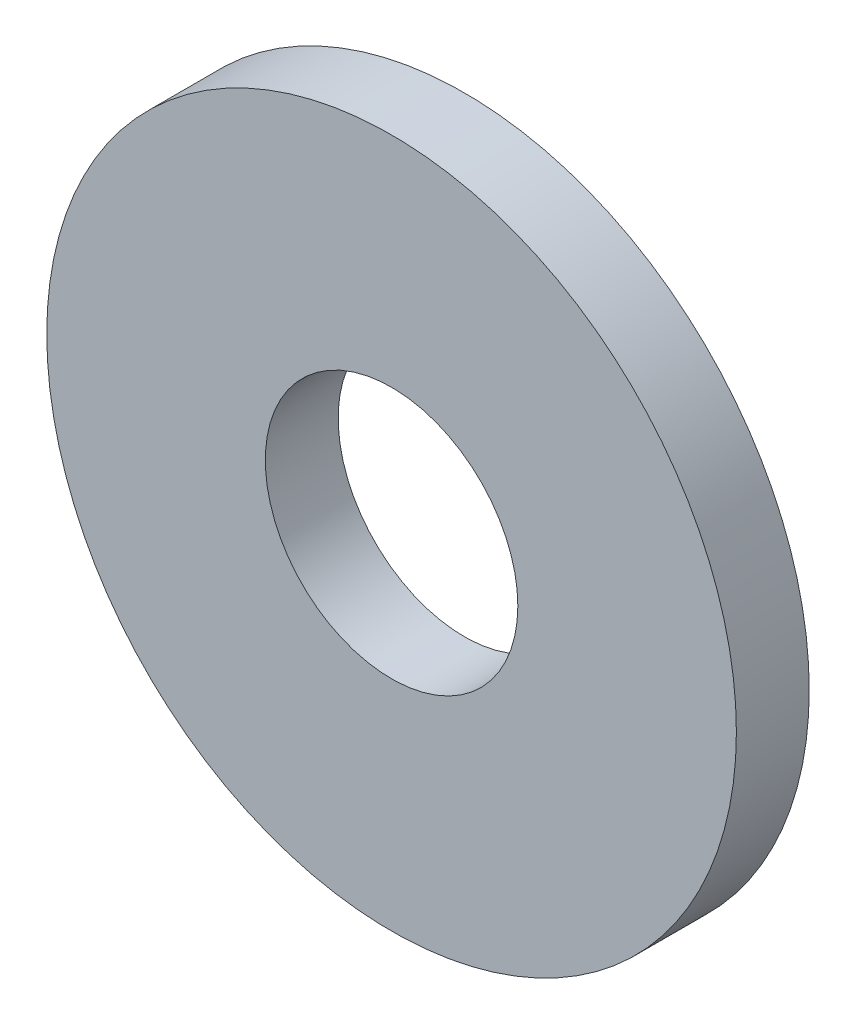
ISO-10303-21;
HEADER;
FILE_DESCRIPTION(('STEP AP214'),'2;1');
FILE_NAME('part.step','',(''),(''),'','','');
FILE_SCHEMA(('AUTOMOTIVE_DESIGN { 1 0 10303 214 1 1 1 1 }'));
ENDSEC;
DATA;
#1=APPLICATION_CONTEXT('core data for automotive mechanical design processes');
#2=APPLICATION_PROTOCOL_DEFINITION('international standard','automotive_design',2000,#1);
#3=PRODUCT_CONTEXT('',#1,'mechanical');
#4=PRODUCT('Part','Part','',(#3));
#5=PRODUCT_RELATED_PRODUCT_CATEGORY('part','',(#4));
#6=PRODUCT_DEFINITION_FORMATION('','',#4);
#7=PRODUCT_DEFINITION_CONTEXT('part definition',#1,'design');
#8=PRODUCT_DEFINITION('design','',#6,#7);
#9=PRODUCT_DEFINITION_SHAPE('','',#8);
#10=(LENGTH_UNIT() NAMED_UNIT(*) SI_UNIT(.MILLI.,.METRE.));
#11=(NAMED_UNIT(*) PLANE_ANGLE_UNIT() SI_UNIT($,.RADIAN.));
#12=(NAMED_UNIT(*) SI_UNIT($,.STERADIAN.) SOLID_ANGLE_UNIT());
#13=UNCERTAINTY_MEASURE_WITH_UNIT(LENGTH_MEASURE(1.E-05),#10,'distance_accuracy_value','');
#14=(GEOMETRIC_REPRESENTATION_CONTEXT(3) GLOBAL_UNCERTAINTY_ASSIGNED_CONTEXT((#13)) GLOBAL_UNIT_ASSIGNED_CONTEXT((#10,
#11,#12)) REPRESENTATION_CONTEXT('',''));
#15=CARTESIAN_POINT('',(0.,0.,0.));
#16=DIRECTION('',(0.,0.,1.));
#17=DIRECTION('',(1.,0.,0.));
#18=AXIS2_PLACEMENT_3D('',#15,#16,#17);
#19=CARTESIAN_POINT('',(0.,0.,15.));
#20=DIRECTION('',(0.,0.,1.));
#21=DIRECTION('',(1.,0.,0.));
#22=AXIS2_PLACEMENT_3D('',#19,#20,#21);
#23=PLANE('',#22);
#24=CARTESIAN_POINT('',(0.,0.,15.));
#25=DIRECTION('',(0.,0.,1.));
#26=DIRECTION('',(1.,0.,0.));
#27=AXIS2_PLACEMENT_3D('',#24,#25,#26);
#28=CIRCLE('',#27,71.);
#29=CARTESIAN_POINT('',(71.,0.,15.));
#30=VERTEX_POINT('',#29);
#31=EDGE_CURVE('E10',#30,#30,#28,.T.);
#32=ORIENTED_EDGE('',*,*,#31,.T.);
#33=EDGE_LOOP('',(#32));
#34=FACE_BOUND('',#33,.T.);
#35=CARTESIAN_POINT('',(0.,0.,15.));
#36=DIRECTION('',(0.,0.,1.));
#37=DIRECTION('',(1.,0.,0.));
#38=AXIS2_PLACEMENT_3D('',#35,#36,#37);
#39=CIRCLE('',#38,26.);
#40=CARTESIAN_POINT('',(26.,0.,15.));
#41=VERTEX_POINT('',#40);
#42=EDGE_CURVE('E50',#41,#41,#39,.T.);
#43=ORIENTED_EDGE('',*,*,#42,.F.);
#44=EDGE_LOOP('',(#43));
#45=FACE_BOUND('',#44,.T.);
#46=ADVANCED_FACE('F37',(#34,#45),#23,.T.);
#47=CARTESIAN_POINT('',(0.,0.,0.));
#48=DIRECTION('',(0.,0.,1.));
#49=DIRECTION('',(1.,0.,0.));
#50=AXIS2_PLACEMENT_3D('',#47,#48,#49);
#51=PLANE('',#50);
#52=CARTESIAN_POINT('',(0.,0.,0.));
#53=DIRECTION('',(0.,0.,1.));
#54=DIRECTION('',(1.,0.,0.));
#55=AXIS2_PLACEMENT_3D('',#52,#53,#54);
#56=CIRCLE('',#55,71.);
#57=CARTESIAN_POINT('',(71.,0.,0.));
#58=VERTEX_POINT('',#57);
#59=EDGE_CURVE('E41',#58,#58,#56,.T.);
#60=ORIENTED_EDGE('',*,*,#59,.F.);
#61=EDGE_LOOP('',(#60));
#62=FACE_BOUND('',#61,.T.);
#63=CARTESIAN_POINT('',(0.,0.,0.));
#64=DIRECTION('',(0.,0.,1.));
#65=DIRECTION('',(1.,0.,0.));
#66=AXIS2_PLACEMENT_3D('',#63,#64,#65);
#67=CIRCLE('',#66,26.);
#68=CARTESIAN_POINT('',(26.,0.,0.));
#69=VERTEX_POINT('',#68);
#70=EDGE_CURVE('E52',#69,#69,#67,.T.);
#71=ORIENTED_EDGE('',*,*,#70,.T.);
#72=EDGE_LOOP('',(#71));
#73=FACE_BOUND('',#72,.T.);
#74=ADVANCED_FACE('F64',(#62,#73),#51,.F.);
#75=CARTESIAN_POINT('',(0.,0.,15.));
#76=DIRECTION('',(0.,0.,-1.));
#77=DIRECTION('',(-1.,0.,0.));
#78=AXIS2_PLACEMENT_3D('',#75,#76,#77);
#79=CYLINDRICAL_SURFACE('',#78,71.);
#80=ORIENTED_EDGE('',*,*,#31,.F.);
#81=EDGE_LOOP('',(#80));
#82=FACE_BOUND('',#81,.T.);
#83=ORIENTED_EDGE('',*,*,#59,.T.);
#84=EDGE_LOOP('',(#83));
#85=FACE_BOUND('',#84,.T.);
#86=ADVANCED_FACE('F39',(#82,#85),#79,.T.);
#87=CARTESIAN_POINT('',(0.,0.,15.));
#88=DIRECTION('',(0.,0.,-1.));
#89=DIRECTION('',(-1.,0.,0.));
#90=AXIS2_PLACEMENT_3D('',#87,#88,#89);
#91=CYLINDRICAL_SURFACE('',#90,26.);
#92=ORIENTED_EDGE('',*,*,#42,.T.);
#93=EDGE_LOOP('',(#92));
#94=FACE_BOUND('',#93,.T.);
#95=ORIENTED_EDGE('',*,*,#70,.F.);
#96=EDGE_LOOP('',(#95));
#97=FACE_BOUND('',#96,.T.);
#98=ADVANCED_FACE('F60',(#94,#97),#91,.F.);
#99=CLOSED_SHELL('',(#46,#74,#86,#98));
#100=MANIFOLD_SOLID_BREP('B2',#99);
#101=ADVANCED_BREP_SHAPE_REPRESENTATION('',(#18,#100),#14);
#102=SHAPE_DEFINITION_REPRESENTATION(#9,#101);
ENDSEC;
END-ISO-10303-21;
